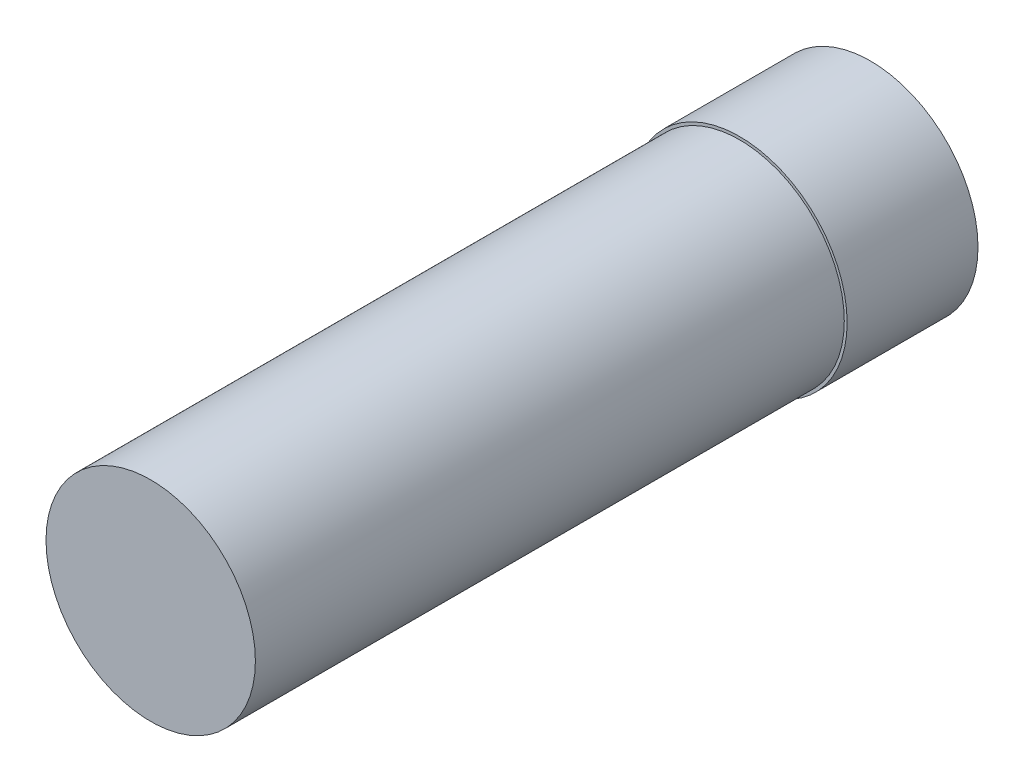
ISO-10303-21;
HEADER;
FILE_DESCRIPTION(('STEP AP214'),'2;1');
FILE_NAME('part.step','',(''),(''),'','','');
FILE_SCHEMA(('AUTOMOTIVE_DESIGN { 1 0 10303 214 1 1 1 1 }'));
ENDSEC;
DATA;
#1=APPLICATION_CONTEXT('core data for automotive mechanical design processes');
#2=APPLICATION_PROTOCOL_DEFINITION('international standard','automotive_design',2000,#1);
#3=PRODUCT_CONTEXT('',#1,'mechanical');
#4=PRODUCT('Part','Part','',(#3));
#5=PRODUCT_RELATED_PRODUCT_CATEGORY('part','',(#4));
#6=PRODUCT_DEFINITION_FORMATION('','',#4);
#7=PRODUCT_DEFINITION_CONTEXT('part definition',#1,'design');
#8=PRODUCT_DEFINITION('design','',#6,#7);
#9=PRODUCT_DEFINITION_SHAPE('','',#8);
#10=(LENGTH_UNIT() NAMED_UNIT(*) SI_UNIT(.MILLI.,.METRE.));
#11=(NAMED_UNIT(*) PLANE_ANGLE_UNIT() SI_UNIT($,.RADIAN.));
#12=(NAMED_UNIT(*) SI_UNIT($,.STERADIAN.) SOLID_ANGLE_UNIT());
#13=UNCERTAINTY_MEASURE_WITH_UNIT(LENGTH_MEASURE(1.E-05),#10,'distance_accuracy_value','');
#14=(GEOMETRIC_REPRESENTATION_CONTEXT(3) GLOBAL_UNCERTAINTY_ASSIGNED_CONTEXT((#13)) GLOBAL_UNIT_ASSIGNED_CONTEXT((#10,
#11,#12)) REPRESENTATION_CONTEXT('',''));
#15=CARTESIAN_POINT('',(0.,0.,0.));
#16=DIRECTION('',(0.,0.,1.));
#17=DIRECTION('',(1.,0.,0.));
#18=AXIS2_PLACEMENT_3D('',#15,#16,#17);
#19=CARTESIAN_POINT('',(0.,0.,3.));
#20=DIRECTION('',(0.,0.,-1.));
#21=DIRECTION('',(-1.,0.,0.));
#22=AXIS2_PLACEMENT_3D('',#19,#20,#21);
#23=CYLINDRICAL_SURFACE('',#22,2.465);
#24=CARTESIAN_POINT('',(0.,0.,3.));
#25=DIRECTION('',(0.,0.,1.));
#26=DIRECTION('',(1.,0.,0.));
#27=AXIS2_PLACEMENT_3D('',#24,#25,#26);
#28=CIRCLE('',#27,2.465);
#29=CARTESIAN_POINT('',(2.465,0.,3.));
#30=VERTEX_POINT('',#29);
#31=EDGE_CURVE('E10',#30,#30,#28,.T.);
#32=ORIENTED_EDGE('',*,*,#31,.F.);
#33=EDGE_LOOP('',(#32));
#34=FACE_BOUND('',#33,.T.);
#35=CARTESIAN_POINT('',(0.,0.,0.));
#36=DIRECTION('',(0.,0.,1.));
#37=DIRECTION('',(1.,0.,0.));
#38=AXIS2_PLACEMENT_3D('',#35,#36,#37);
#39=CIRCLE('',#38,2.465);
#40=CARTESIAN_POINT('',(2.465,0.,0.));
#41=VERTEX_POINT('',#40);
#42=EDGE_CURVE('E34',#41,#41,#39,.T.);
#43=ORIENTED_EDGE('',*,*,#42,.T.);
#44=EDGE_LOOP('',(#43));
#45=FACE_BOUND('',#44,.T.);
#46=ADVANCED_FACE('F31',(#34,#45),#23,.T.);
#47=CARTESIAN_POINT('',(0.,0.,3.));
#48=DIRECTION('',(0.,0.,1.));
#49=DIRECTION('',(1.,0.,0.));
#50=AXIS2_PLACEMENT_3D('',#47,#48,#49);
#51=PLANE('',#50);
#52=CARTESIAN_POINT('',(0.,0.,3.));
#53=DIRECTION('',(0.,0.,1.));
#54=DIRECTION('',(1.,0.,0.));
#55=AXIS2_PLACEMENT_3D('',#52,#53,#54);
#56=CIRCLE('',#55,2.4);
#57=CARTESIAN_POINT('',(2.4,0.,3.));
#58=VERTEX_POINT('',#57);
#59=EDGE_CURVE('E43',#58,#58,#56,.T.);
#60=ORIENTED_EDGE('',*,*,#59,.F.);
#61=EDGE_LOOP('',(#60));
#62=FACE_BOUND('',#61,.T.);
#63=ORIENTED_EDGE('',*,*,#31,.T.);
#64=EDGE_LOOP('',(#63));
#65=FACE_BOUND('',#64,.T.);
#66=ADVANCED_FACE('F58',(#62,#65),#51,.T.);
#67=CARTESIAN_POINT('',(0.,0.,0.));
#68=DIRECTION('',(0.,0.,1.));
#69=DIRECTION('',(1.,0.,0.));
#70=AXIS2_PLACEMENT_3D('',#67,#68,#69);
#71=PLANE('',#70);
#72=ORIENTED_EDGE('',*,*,#42,.F.);
#73=EDGE_LOOP('',(#72));
#74=FACE_BOUND('',#73,.T.);
#75=ADVANCED_FACE('F54',(#74),#71,.F.);
#76=CARTESIAN_POINT('',(0.,0.,16.5));
#77=DIRECTION('',(0.,0.,-1.));
#78=DIRECTION('',(-1.,0.,0.));
#79=AXIS2_PLACEMENT_3D('',#76,#77,#78);
#80=CYLINDRICAL_SURFACE('',#79,2.4);
#81=CARTESIAN_POINT('',(0.,0.,16.5));
#82=DIRECTION('',(0.,0.,1.));
#83=DIRECTION('',(1.,0.,0.));
#84=AXIS2_PLACEMENT_3D('',#81,#82,#83);
#85=CIRCLE('',#84,2.4);
#86=CARTESIAN_POINT('',(2.4,0.,16.5));
#87=VERTEX_POINT('',#86);
#88=EDGE_CURVE('E41',#87,#87,#85,.T.);
#89=ORIENTED_EDGE('',*,*,#88,.F.);
#90=EDGE_LOOP('',(#89));
#91=FACE_BOUND('',#90,.T.);
#92=ORIENTED_EDGE('',*,*,#59,.T.);
#93=EDGE_LOOP('',(#92));
#94=FACE_BOUND('',#93,.T.);
#95=ADVANCED_FACE('F51',(#91,#94),#80,.T.);
#96=CARTESIAN_POINT('',(0.,0.,16.5));
#97=DIRECTION('',(0.,0.,1.));
#98=DIRECTION('',(1.,0.,0.));
#99=AXIS2_PLACEMENT_3D('',#96,#97,#98);
#100=PLANE('',#99);
#101=ORIENTED_EDGE('',*,*,#88,.T.);
#102=EDGE_LOOP('',(#101));
#103=FACE_BOUND('',#102,.T.);
#104=ADVANCED_FACE('F49',(#103),#100,.T.);
#105=CLOSED_SHELL('',(#46,#66,#75,#95,#104));
#106=MANIFOLD_SOLID_BREP('B2',#105);
#107=ADVANCED_BREP_SHAPE_REPRESENTATION('',(#18,#106),#14);
#108=SHAPE_DEFINITION_REPRESENTATION(#9,#107);
ENDSEC;
END-ISO-10303-21;
